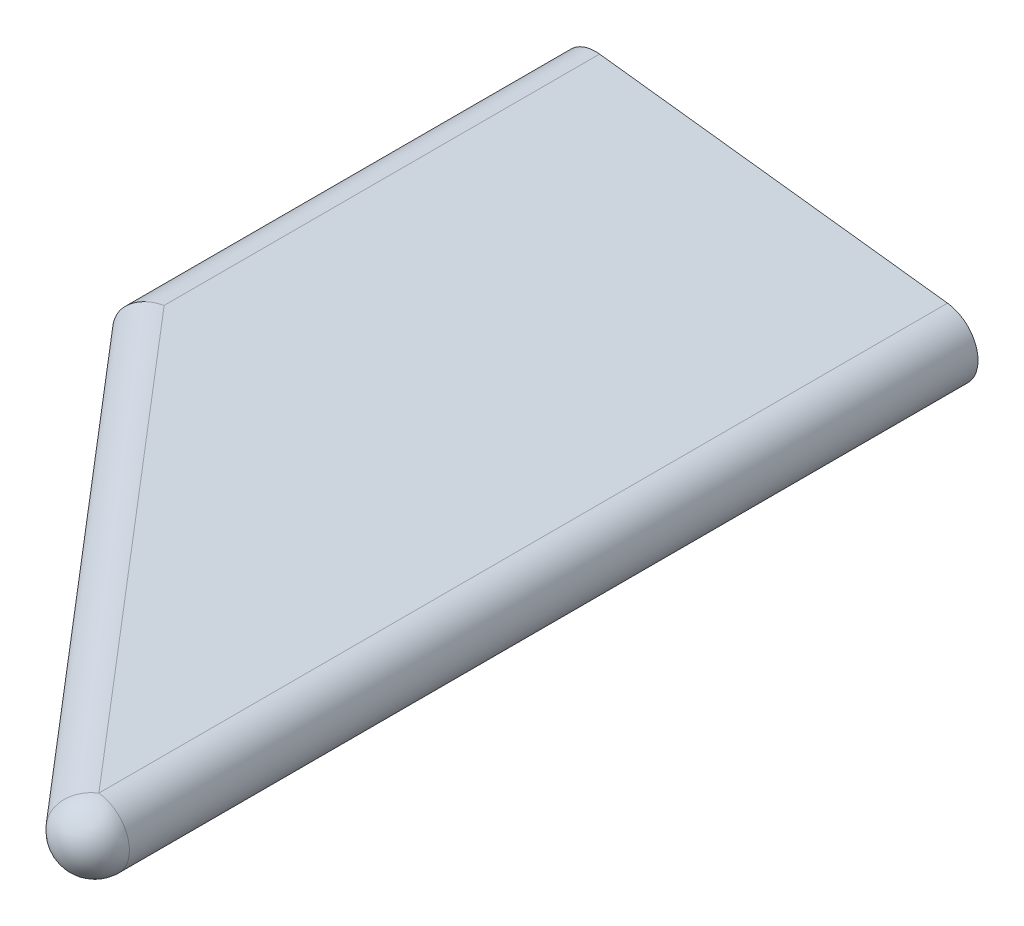
ISO-10303-21;
HEADER;
FILE_DESCRIPTION(('STEP AP214'),'2;1');
FILE_NAME('part.step','',(''),(''),'','','');
FILE_SCHEMA(('AUTOMOTIVE_DESIGN { 1 0 10303 214 1 1 1 1 }'));
ENDSEC;
DATA;
#1=APPLICATION_CONTEXT('core data for automotive mechanical design processes');
#2=APPLICATION_PROTOCOL_DEFINITION('international standard','automotive_design',2000,#1);
#3=PRODUCT_CONTEXT('',#1,'mechanical');
#4=PRODUCT('Part','Part','',(#3));
#5=PRODUCT_RELATED_PRODUCT_CATEGORY('part','',(#4));
#6=PRODUCT_DEFINITION_FORMATION('','',#4);
#7=PRODUCT_DEFINITION_CONTEXT('part definition',#1,'design');
#8=PRODUCT_DEFINITION('design','',#6,#7);
#9=PRODUCT_DEFINITION_SHAPE('','',#8);
#10=(LENGTH_UNIT() NAMED_UNIT(*) SI_UNIT(.MILLI.,.METRE.));
#11=(NAMED_UNIT(*) PLANE_ANGLE_UNIT() SI_UNIT($,.RADIAN.));
#12=(NAMED_UNIT(*) SI_UNIT($,.STERADIAN.) SOLID_ANGLE_UNIT());
#13=UNCERTAINTY_MEASURE_WITH_UNIT(LENGTH_MEASURE(1.E-05),#10,'distance_accuracy_value','');
#14=(GEOMETRIC_REPRESENTATION_CONTEXT(3) GLOBAL_UNCERTAINTY_ASSIGNED_CONTEXT((#13)) GLOBAL_UNIT_ASSIGNED_CONTEXT((#10,
#11,#12)) REPRESENTATION_CONTEXT('',''));
#15=CARTESIAN_POINT('',(0.,0.,0.));
#16=DIRECTION('',(0.,0.,1.));
#17=DIRECTION('',(1.,0.,0.));
#18=AXIS2_PLACEMENT_3D('',#15,#16,#17);
#19=CARTESIAN_POINT('',(43.0923431739987,8.19260397576325,85.9529185099897));
#20=DIRECTION('',(-0.642220061581513,-0.0770664073897816,-0.762636323128049));
#21=DIRECTION('',(-0.764911198117052,0.,0.644135745782779));
#22=AXIS2_PLACEMENT_3D('',#19,#20,#21);
#23=CYLINDRICAL_SURFACE('',#22,3.);
#24=CARTESIAN_POINT('',(3.,3.3815227948834,38.3432609908661));
#25=DIRECTION('',(0.342048359851506,0.0410458031821807,0.938785471534378));
#26=DIRECTION('',(-0.932098350994508,-0.111851802119341,0.344502305414602));
#27=AXIS2_PLACEMENT_3D('',#24,#25,#26);
#28=ELLIPSE('',#27,3.19561826526428,3.);
#29=CARTESIAN_POINT('',(3.35743566185529,0.402892279422635,38.3432609908661));
#30=VERTEX_POINT('',#29);
#31=CARTESIAN_POINT('',(0.00118997270207538,3.29703362292979,39.4395774640902));
#32=VERTEX_POINT('',#31);
#33=EDGE_CURVE('E11',#30,#32,#28,.F.);
#34=ORIENTED_EDGE('',*,*,#33,.F.);
#35=DIRECTION('',(-0.642220061581513,-0.0770664073897816,-0.762636323128049));
#36=VECTOR('',#35,1.);
#37=CARTESIAN_POINT('',(43.449778835854,5.21397346030248,85.9529185099897));
#38=LINE('',#37,#36);
#39=CARTESIAN_POINT('',(33.5114123711603,4.02136948453924,74.1511083331659));
#40=VERTEX_POINT('',#39);
#41=EDGE_CURVE('E165',#40,#30,#38,.T.);
#42=ORIENTED_EDGE('',*,*,#41,.F.);
#43=CARTESIAN_POINT('',(33.153976709305,7.,74.1511083331659));
#44=DIRECTION('',(-0.642220061581507,-0.0770664073897801,-0.762636323128054));
#45=DIRECTION('',(-0.764911198117057,0.,0.644135745782773));
#46=AXIS2_PLACEMENT_3D('',#43,#44,#45);
#47=CIRCLE('',#46,3.);
#48=CARTESIAN_POINT('',(30.8592431149538,7.,76.0835155705142));
#49=VERTEX_POINT('',#48);
#50=EDGE_CURVE('E47',#40,#49,#47,.T.);
#51=ORIENTED_EDGE('',*,*,#50,.T.);
#52=DIRECTION('',(-0.642220061581513,-0.0770664073897816,-0.762636323128049));
#53=VECTOR('',#52,1.);
#54=CARTESIAN_POINT('',(-18.7863024791892,1.04253452870284,17.1294301774693));
#55=LINE('',#54,#53);
#56=EDGE_CURVE('E152',#32,#49,#55,.F.);
#57=ORIENTED_EDGE('',*,*,#56,.F.);
#58=EDGE_LOOP('',(#34,#42,#51,#57));
#59=FACE_BOUND('',#58,.T.);
#60=ADVANCED_FACE('F38',(#59),#23,.T.);
#61=CARTESIAN_POINT('',(33.153976709305,7.,74.1511083331659));
#62=DIRECTION('',(-0.119145220618431,0.992876838486922,0.));
#63=DIRECTION('',(-0.992876838486922,-0.119145220618431,0.));
#64=AXIS2_PLACEMENT_3D('',#61,#62,#63);
#65=SPHERICAL_SURFACE('',#64,3.);
#66=ORIENTED_EDGE('',*,*,#50,.F.);
#67=CARTESIAN_POINT('',(33.153976709305,7.,74.1511083331659));
#68=DIRECTION('',(0.,0.,1.));
#69=DIRECTION('',(1.,0.,0.));
#70=AXIS2_PLACEMENT_3D('',#67,#68,#69);
#71=CIRCLE('',#70,3.);
#72=CARTESIAN_POINT('',(33.5114123711603,9.97863051546076,74.1511083331659));
#73=VERTEX_POINT('',#72);
#74=EDGE_CURVE('E160',#40,#73,#71,.T.);
#75=ORIENTED_EDGE('',*,*,#74,.T.);
#76=CARTESIAN_POINT('',(33.153976709305,7.,74.1511083331659));
#77=DIRECTION('',(-0.642220061581513,0.0770664073897816,-0.762636323128049));
#78=DIRECTION('',(-0.764911198117052,0.,0.644135745782779));
#79=AXIS2_PLACEMENT_3D('',#76,#77,#78);
#80=CIRCLE('',#79,3.);
#81=EDGE_CURVE('E146',#49,#73,#80,.T.);
#82=ORIENTED_EDGE('',*,*,#81,.F.);
#83=EDGE_LOOP('',(#66,#75,#82));
#84=FACE_BOUND('',#83,.T.);
#85=ADVANCED_FACE('F173',(#84),#65,.T.);
#86=CARTESIAN_POINT('',(33.153976709305,7.,80.3575127424868));
#87=DIRECTION('',(0.,0.,-1.));
#88=DIRECTION('',(-1.,0.,0.));
#89=AXIS2_PLACEMENT_3D('',#86,#87,#88);
#90=CYLINDRICAL_SURFACE('',#89,3.);
#91=ORIENTED_EDGE('',*,*,#74,.F.);
#92=DIRECTION('',(0.,0.,1.));
#93=VECTOR('',#92,1.);
#94=CARTESIAN_POINT('',(33.5114123711603,4.02136948453924,80.3575127424868));
#95=LINE('',#94,#93);
#96=CARTESIAN_POINT('',(33.5114123711603,4.02136948453923,0.605439196676902));
#97=VERTEX_POINT('',#96);
#98=EDGE_CURVE('E186',#97,#40,#95,.T.);
#99=ORIENTED_EDGE('',*,*,#98,.F.);
#100=CARTESIAN_POINT('',(33.153976709305,7.,0.605439196676896));
#101=DIRECTION('',(0.,0.,-1.));
#102=DIRECTION('',(-1.,0.,0.));
#103=AXIS2_PLACEMENT_3D('',#100,#101,#102);
#104=CIRCLE('',#103,3.);
#105=CARTESIAN_POINT('',(33.5114123711603,9.97863051546077,0.605439196676902));
#106=VERTEX_POINT('',#105);
#107=EDGE_CURVE('E144',#106,#97,#104,.T.);
#108=ORIENTED_EDGE('',*,*,#107,.F.);
#109=DIRECTION('',(0.,0.,1.));
#110=VECTOR('',#109,1.);
#111=CARTESIAN_POINT('',(33.5114123711603,9.97863051546077,80.3575127424868));
#112=LINE('',#111,#110);
#113=EDGE_CURVE('E126',#73,#106,#112,.F.);
#114=ORIENTED_EDGE('',*,*,#113,.F.);
#115=EDGE_LOOP('',(#91,#99,#108,#114));
#116=FACE_BOUND('',#115,.T.);
#117=ADVANCED_FACE('F193',(#116),#90,.T.);
#118=CARTESIAN_POINT('',(3.,3.3815227948834,80.3575127424868));
#119=DIRECTION('',(0.,0.,1.));
#120=DIRECTION('',(1.,0.,0.));
#121=AXIS2_PLACEMENT_3D('',#118,#119,#120);
#122=CYLINDRICAL_SURFACE('',#121,3.);
#123=DIRECTION('',(0.,0.,-1.));
#124=VECTOR('',#123,1.);
#125=CARTESIAN_POINT('',(3.35743566185529,0.402892279422636,80.3575127424868));
#126=LINE('',#125,#124);
#127=CARTESIAN_POINT('',(3.3574356618553,0.402892279422635,0.605439196676902));
#128=VERTEX_POINT('',#127);
#129=EDGE_CURVE('E176',#30,#128,#126,.T.);
#130=ORIENTED_EDGE('',*,*,#129,.F.);
#131=ORIENTED_EDGE('',*,*,#33,.T.);
#132=CARTESIAN_POINT('',(3.,3.3815227948834,43.0006643715065));
#133=DIRECTION('',(0.764911198117052,0.,-0.644135745782779));
#134=DIRECTION('',(0.644135745782779,0.,0.764911198117052));
#135=AXIS2_PLACEMENT_3D('',#132,#133,#134);
#136=ELLIPSE('',#135,4.65740338064034,3.);
#137=CARTESIAN_POINT('',(0.,3.3815227948834,39.4381643715065));
#138=VERTEX_POINT('',#137);
#139=EDGE_CURVE('E149',#138,#32,#136,.F.);
#140=ORIENTED_EDGE('',*,*,#139,.F.);
#141=DIRECTION('',(0.,0.,-1.));
#142=VECTOR('',#141,1.);
#143=CARTESIAN_POINT('',(0.,3.3815227948834,80.3575127424868));
#144=LINE('',#143,#142);
#145=CARTESIAN_POINT('',(0.,3.3815227948834,0.605439196676902));
#146=VERTEX_POINT('',#145);
#147=EDGE_CURVE('E60',#146,#138,#144,.F.);
#148=ORIENTED_EDGE('',*,*,#147,.F.);
#149=CARTESIAN_POINT('',(3.,3.3815227948834,0.605439196676896));
#150=DIRECTION('',(0.,0.,-1.));
#151=DIRECTION('',(-1.,0.,0.));
#152=AXIS2_PLACEMENT_3D('',#149,#150,#151);
#153=CIRCLE('',#152,3.);
#154=EDGE_CURVE('E189',#128,#146,#153,.T.);
#155=ORIENTED_EDGE('',*,*,#154,.F.);
#156=EDGE_LOOP('',(#130,#131,#140,#148,#155));
#157=FACE_BOUND('',#156,.T.);
#158=ADVANCED_FACE('F40',(#157),#122,.T.);
#159=CARTESIAN_POINT('',(-78.0055218485684,20.3391398269448,-57.850796204309));
#160=DIRECTION('',(-0.642220061581513,0.0770664073897816,-0.762636323128049));
#161=DIRECTION('',(-0.764911198117052,0.,0.644135745782779));
#162=AXIS2_PLACEMENT_3D('',#159,#160,#161);
#163=CYLINDRICAL_SURFACE('',#162,3.);
#164=DIRECTION('',(0.642220061581513,-0.0770664073897816,0.762636323128049));
#165=VECTOR('',#164,1.);
#166=CARTESIAN_POINT('',(-80.3002554429195,20.3391398269448,-55.9183889669606));
#167=LINE('',#166,#165);
#168=CARTESIAN_POINT('',(0.00118997270207586,10.7029663770702,39.4395774640902));
#169=VERTEX_POINT('',#168);
#170=EDGE_CURVE('E120',#49,#169,#167,.F.);
#171=ORIENTED_EDGE('',*,*,#170,.F.);
#172=ORIENTED_EDGE('',*,*,#81,.T.);
#173=DIRECTION('',(0.642220061581513,-0.0770664073897816,0.762636323128049));
#174=VECTOR('',#173,1.);
#175=CARTESIAN_POINT('',(-77.6480861867131,23.3177703424056,-57.850796204309));
#176=LINE('',#175,#174);
#177=CARTESIAN_POINT('',(3.35743566185529,13.5971077205774,38.3432609908661));
#178=VERTEX_POINT('',#177);
#179=EDGE_CURVE('E121',#178,#73,#176,.T.);
#180=ORIENTED_EDGE('',*,*,#179,.F.);
#181=CARTESIAN_POINT('',(3.,10.6184772051166,38.3432609908662));
#182=DIRECTION('',(-0.342048359851506,0.0410458031821807,-0.938785471534378));
#183=DIRECTION('',(-0.932098350994508,0.111851802119341,0.344502305414602));
#184=AXIS2_PLACEMENT_3D('',#181,#182,#183);
#185=ELLIPSE('',#184,3.19561826526428,3.);
#186=EDGE_CURVE('E109',#178,#169,#185,.F.);
#187=ORIENTED_EDGE('',*,*,#186,.T.);
#188=EDGE_LOOP('',(#171,#172,#180,#187));
#189=FACE_BOUND('',#188,.T.);
#190=ADVANCED_FACE('F175',(#189),#163,.T.);
#191=CARTESIAN_POINT('',(3.,10.6184772051166,-166.891822417194));
#192=DIRECTION('',(0.,0.,1.));
#193=DIRECTION('',(1.,0.,0.));
#194=AXIS2_PLACEMENT_3D('',#191,#192,#193);
#195=CYLINDRICAL_SURFACE('',#194,3.);
#196=ORIENTED_EDGE('',*,*,#186,.F.);
#197=DIRECTION('',(0.,0.,1.));
#198=VECTOR('',#197,1.);
#199=CARTESIAN_POINT('',(3.35743566185529,13.5971077205774,-166.891822417194));
#200=LINE('',#199,#198);
#201=CARTESIAN_POINT('',(3.35743566185529,13.5971077205774,0.605439196676902));
#202=VERTEX_POINT('',#201);
#203=EDGE_CURVE('E113',#202,#178,#200,.T.);
#204=ORIENTED_EDGE('',*,*,#203,.F.);
#205=CARTESIAN_POINT('',(3.,10.6184772051166,0.60543919667691));
#206=DIRECTION('',(0.,0.,-1.));
#207=DIRECTION('',(-1.,0.,0.));
#208=AXIS2_PLACEMENT_3D('',#205,#206,#207);
#209=CIRCLE('',#208,3.);
#210=CARTESIAN_POINT('',(0.,10.6184772051166,0.605439196676902));
#211=VERTEX_POINT('',#210);
#212=EDGE_CURVE('E100',#211,#202,#209,.T.);
#213=ORIENTED_EDGE('',*,*,#212,.F.);
#214=DIRECTION('',(0.,0.,1.));
#215=VECTOR('',#214,1.);
#216=CARTESIAN_POINT('',(0.,10.6184772051166,0.));
#217=LINE('',#216,#215);
#218=CARTESIAN_POINT('',(0.,10.6184772051166,39.4381643715065));
#219=VERTEX_POINT('',#218);
#220=EDGE_CURVE('E110',#219,#211,#217,.F.);
#221=ORIENTED_EDGE('',*,*,#220,.F.);
#222=CARTESIAN_POINT('',(3.,10.6184772051166,43.0006643715065));
#223=DIRECTION('',(0.764911198117052,0.,-0.644135745782779));
#224=DIRECTION('',(0.644135745782779,0.,0.764911198117052));
#225=AXIS2_PLACEMENT_3D('',#222,#223,#224);
#226=ELLIPSE('',#225,4.65740338064034,3.);
#227=EDGE_CURVE('E139',#169,#219,#226,.F.);
#228=ORIENTED_EDGE('',*,*,#227,.F.);
#229=EDGE_LOOP('',(#196,#204,#213,#221,#228));
#230=FACE_BOUND('',#229,.T.);
#231=ADVANCED_FACE('F114',(#230),#195,.T.);
#232=CARTESIAN_POINT('',(-19.4314456546807,14.,16.3633226565732));
#233=DIRECTION('',(0.764911198117052,0.,-0.644135745782779));
#234=DIRECTION('',(-0.644135745782779,0.,-0.764911198117052));
#235=AXIS2_PLACEMENT_3D('',#232,#233,#234);
#236=PLANE('',#235);
#237=ORIENTED_EDGE('',*,*,#139,.T.);
#238=ORIENTED_EDGE('',*,*,#56,.T.);
#239=ORIENTED_EDGE('',*,*,#170,.T.);
#240=ORIENTED_EDGE('',*,*,#227,.T.);
#241=DIRECTION('',(0.,-1.,0.));
#242=VECTOR('',#241,1.);
#243=CARTESIAN_POINT('',(0.,14.,39.4381643715065));
#244=LINE('',#243,#242);
#245=EDGE_CURVE('E129',#219,#138,#244,.T.);
#246=ORIENTED_EDGE('',*,*,#245,.T.);
#247=EDGE_LOOP('',(#237,#238,#239,#240,#246));
#248=FACE_BOUND('',#247,.T.);
#249=ADVANCED_FACE('F170',(#248),#236,.F.);
#250=CARTESIAN_POINT('',(0.,14.,0.605439196676902));
#251=DIRECTION('',(0.,0.,-1.));
#252=DIRECTION('',(-1.,0.,0.));
#253=AXIS2_PLACEMENT_3D('',#250,#251,#252);
#254=PLANE('',#253);
#255=DIRECTION('',(0.992876838486922,-0.119145220618431,0.));
#256=VECTOR('',#255,1.);
#257=CARTESIAN_POINT('',(0.,14.,0.605439196676902));
#258=LINE('',#257,#256);
#259=EDGE_CURVE('E104',#202,#106,#258,.T.);
#260=ORIENTED_EDGE('',*,*,#259,.T.);
#261=ORIENTED_EDGE('',*,*,#107,.T.);
#262=DIRECTION('',(0.992876838486922,0.119145220618431,0.));
#263=VECTOR('',#262,1.);
#264=CARTESIAN_POINT('',(50.,6.,0.605439196676902));
#265=LINE('',#264,#263);
#266=EDGE_CURVE('E127',#128,#97,#265,.T.);
#267=ORIENTED_EDGE('',*,*,#266,.F.);
#268=ORIENTED_EDGE('',*,*,#154,.T.);
#269=DIRECTION('',(0.,-1.,0.));
#270=VECTOR('',#269,1.);
#271=CARTESIAN_POINT('',(0.,14.,0.605439196676902));
#272=LINE('',#271,#270);
#273=EDGE_CURVE('E106',#211,#146,#272,.T.);
#274=ORIENTED_EDGE('',*,*,#273,.F.);
#275=ORIENTED_EDGE('',*,*,#212,.T.);
#276=EDGE_LOOP('',(#260,#261,#267,#268,#274,#275));
#277=FACE_BOUND('',#276,.T.);
#278=ADVANCED_FACE('F102',(#277),#254,.T.);
#279=CARTESIAN_POINT('',(0.,14.,0.));
#280=DIRECTION('',(-1.,0.,0.));
#281=DIRECTION('',(0.,0.,1.));
#282=AXIS2_PLACEMENT_3D('',#279,#280,#281);
#283=PLANE('',#282);
#284=ORIENTED_EDGE('',*,*,#273,.T.);
#285=ORIENTED_EDGE('',*,*,#147,.T.);
#286=ORIENTED_EDGE('',*,*,#245,.F.);
#287=ORIENTED_EDGE('',*,*,#220,.T.);
#288=EDGE_LOOP('',(#284,#285,#286,#287));
#289=FACE_BOUND('',#288,.T.);
#290=ADVANCED_FACE('F196',(#289),#283,.T.);
#291=CARTESIAN_POINT('',(50.,8.,-166.891822417194));
#292=DIRECTION('',(0.119145220618431,0.992876838486922,0.));
#293=DIRECTION('',(-0.992876838486922,0.119145220618431,0.));
#294=AXIS2_PLACEMENT_3D('',#291,#292,#293);
#295=PLANE('',#294);
#296=ORIENTED_EDGE('',*,*,#179,.T.);
#297=ORIENTED_EDGE('',*,*,#113,.T.);
#298=ORIENTED_EDGE('',*,*,#259,.F.);
#299=ORIENTED_EDGE('',*,*,#203,.T.);
#300=EDGE_LOOP('',(#296,#297,#298,#299));
#301=FACE_BOUND('',#300,.T.);
#302=ADVANCED_FACE('F124',(#301),#295,.T.);
#303=CARTESIAN_POINT('',(50.,6.,80.3575127424868));
#304=DIRECTION('',(-0.119145220618431,0.992876838486922,0.));
#305=DIRECTION('',(-0.992876838486922,-0.119145220618431,0.));
#306=AXIS2_PLACEMENT_3D('',#303,#304,#305);
#307=PLANE('',#306);
#308=ORIENTED_EDGE('',*,*,#266,.T.);
#309=ORIENTED_EDGE('',*,*,#98,.T.);
#310=ORIENTED_EDGE('',*,*,#41,.T.);
#311=ORIENTED_EDGE('',*,*,#129,.T.);
#312=EDGE_LOOP('',(#308,#309,#310,#311));
#313=FACE_BOUND('',#312,.T.);
#314=ADVANCED_FACE('F195',(#313),#307,.F.);
#315=CLOSED_SHELL('',(#60,#85,#117,#158,#190,#231,#249,#278,#290,#302,#314));
#316=MANIFOLD_SOLID_BREP('B2',#315);
#317=ADVANCED_BREP_SHAPE_REPRESENTATION('',(#18,#316),#14);
#318=SHAPE_DEFINITION_REPRESENTATION(#9,#317);
ENDSEC;
END-ISO-10303-21;
